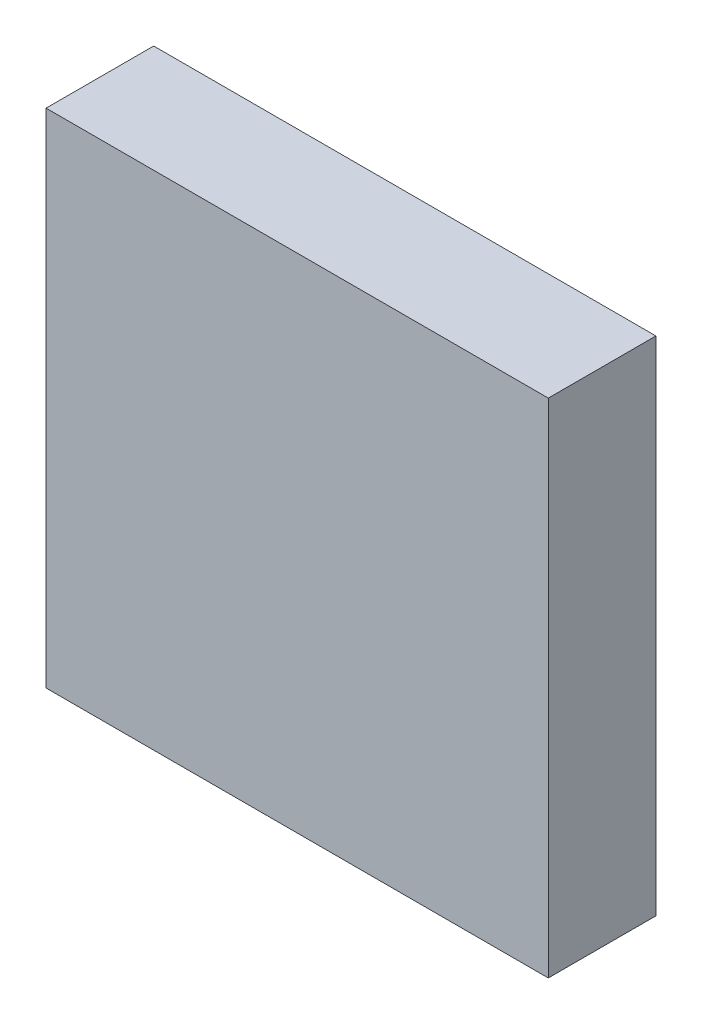
ISO-10303-21;
HEADER;
FILE_DESCRIPTION(('STEP AP214'),'2;1');
FILE_NAME('part.step','',(''),(''),'','','');
FILE_SCHEMA(('AUTOMOTIVE_DESIGN { 1 0 10303 214 1 1 1 1 }'));
ENDSEC;
DATA;
#1=APPLICATION_CONTEXT('core data for automotive mechanical design processes');
#2=APPLICATION_PROTOCOL_DEFINITION('international standard','automotive_design',2000,#1);
#3=PRODUCT_CONTEXT('',#1,'mechanical');
#4=PRODUCT('Part','Part','',(#3));
#5=PRODUCT_RELATED_PRODUCT_CATEGORY('part','',(#4));
#6=PRODUCT_DEFINITION_FORMATION('','',#4);
#7=PRODUCT_DEFINITION_CONTEXT('part definition',#1,'design');
#8=PRODUCT_DEFINITION('design','',#6,#7);
#9=PRODUCT_DEFINITION_SHAPE('','',#8);
#10=(LENGTH_UNIT() NAMED_UNIT(*) SI_UNIT(.MILLI.,.METRE.));
#11=(NAMED_UNIT(*) PLANE_ANGLE_UNIT() SI_UNIT($,.RADIAN.));
#12=(NAMED_UNIT(*) SI_UNIT($,.STERADIAN.) SOLID_ANGLE_UNIT());
#13=UNCERTAINTY_MEASURE_WITH_UNIT(LENGTH_MEASURE(1.E-05),#10,'distance_accuracy_value','');
#14=(GEOMETRIC_REPRESENTATION_CONTEXT(3) GLOBAL_UNCERTAINTY_ASSIGNED_CONTEXT((#13)) GLOBAL_UNIT_ASSIGNED_CONTEXT((#10,
#11,#12)) REPRESENTATION_CONTEXT('',''));
#15=CARTESIAN_POINT('',(0.,0.,0.));
#16=DIRECTION('',(0.,0.,1.));
#17=DIRECTION('',(1.,0.,0.));
#18=AXIS2_PLACEMENT_3D('',#15,#16,#17);
#19=CARTESIAN_POINT('',(0.,0.,19.05));
#20=DIRECTION('',(1.,0.,0.));
#21=DIRECTION('',(0.,0.,-1.));
#22=AXIS2_PLACEMENT_3D('',#19,#20,#21);
#23=PLANE('',#22);
#24=DIRECTION('',(0.,-1.,0.));
#25=VECTOR('',#24,1.);
#26=CARTESIAN_POINT('',(0.,0.,0.));
#27=LINE('',#26,#25);
#28=CARTESIAN_POINT('',(0.,88.9,0.));
#29=VERTEX_POINT('',#28);
#30=CARTESIAN_POINT('',(0.,0.,0.));
#31=VERTEX_POINT('',#30);
#32=EDGE_CURVE('E105',#29,#31,#27,.T.);
#33=ORIENTED_EDGE('',*,*,#32,.T.);
#34=DIRECTION('',(0.,0.,-1.));
#35=VECTOR('',#34,1.);
#36=CARTESIAN_POINT('',(0.,0.,19.05));
#37=LINE('',#36,#35);
#38=CARTESIAN_POINT('',(0.,0.,19.05));
#39=VERTEX_POINT('',#38);
#40=EDGE_CURVE('E11',#39,#31,#37,.T.);
#41=ORIENTED_EDGE('',*,*,#40,.F.);
#42=DIRECTION('',(0.,-1.,0.));
#43=VECTOR('',#42,1.);
#44=CARTESIAN_POINT('',(0.,0.,19.05));
#45=LINE('',#44,#43);
#46=CARTESIAN_POINT('',(0.,88.9,19.05));
#47=VERTEX_POINT('',#46);
#48=EDGE_CURVE('E89',#47,#39,#45,.T.);
#49=ORIENTED_EDGE('',*,*,#48,.F.);
#50=DIRECTION('',(0.,0.,-1.));
#51=VECTOR('',#50,1.);
#52=CARTESIAN_POINT('',(0.,88.9,19.05));
#53=LINE('',#52,#51);
#54=EDGE_CURVE('E97',#47,#29,#53,.T.);
#55=ORIENTED_EDGE('',*,*,#54,.T.);
#56=EDGE_LOOP('',(#33,#41,#49,#55));
#57=FACE_BOUND('',#56,.T.);
#58=ADVANCED_FACE('F39',(#57),#23,.F.);
#59=CARTESIAN_POINT('',(0.,0.,19.05));
#60=DIRECTION('',(0.,1.,0.));
#61=DIRECTION('',(0.,0.,1.));
#62=AXIS2_PLACEMENT_3D('',#59,#60,#61);
#63=PLANE('',#62);
#64=DIRECTION('',(1.,0.,0.));
#65=VECTOR('',#64,1.);
#66=CARTESIAN_POINT('',(0.,0.,0.));
#67=LINE('',#66,#65);
#68=CARTESIAN_POINT('',(88.9,0.,0.));
#69=VERTEX_POINT('',#68);
#70=EDGE_CURVE('E92',#31,#69,#67,.T.);
#71=ORIENTED_EDGE('',*,*,#70,.T.);
#72=DIRECTION('',(0.,0.,-1.));
#73=VECTOR('',#72,1.);
#74=CARTESIAN_POINT('',(88.9,0.,19.05));
#75=LINE('',#74,#73);
#76=CARTESIAN_POINT('',(88.9,0.,19.05));
#77=VERTEX_POINT('',#76);
#78=EDGE_CURVE('E50',#77,#69,#75,.T.);
#79=ORIENTED_EDGE('',*,*,#78,.F.);
#80=DIRECTION('',(1.,0.,0.));
#81=VECTOR('',#80,1.);
#82=CARTESIAN_POINT('',(0.,0.,19.05));
#83=LINE('',#82,#81);
#84=EDGE_CURVE('E82',#39,#77,#83,.T.);
#85=ORIENTED_EDGE('',*,*,#84,.F.);
#86=ORIENTED_EDGE('',*,*,#40,.T.);
#87=EDGE_LOOP('',(#71,#79,#85,#86));
#88=FACE_BOUND('',#87,.T.);
#89=ADVANCED_FACE('F93',(#88),#63,.F.);
#90=CARTESIAN_POINT('',(88.9,0.,19.05));
#91=DIRECTION('',(-1.,0.,0.));
#92=DIRECTION('',(0.,0.,1.));
#93=AXIS2_PLACEMENT_3D('',#90,#91,#92);
#94=PLANE('',#93);
#95=DIRECTION('',(0.,1.,0.));
#96=VECTOR('',#95,1.);
#97=CARTESIAN_POINT('',(88.9,0.,0.));
#98=LINE('',#97,#96);
#99=CARTESIAN_POINT('',(88.9,88.9,0.));
#100=VERTEX_POINT('',#99);
#101=EDGE_CURVE('E72',#69,#100,#98,.T.);
#102=ORIENTED_EDGE('',*,*,#101,.T.);
#103=DIRECTION('',(0.,0.,-1.));
#104=VECTOR('',#103,1.);
#105=CARTESIAN_POINT('',(88.9,88.9,19.05));
#106=LINE('',#105,#104);
#107=CARTESIAN_POINT('',(88.9,88.9,19.05));
#108=VERTEX_POINT('',#107);
#109=EDGE_CURVE('E94',#108,#100,#106,.T.);
#110=ORIENTED_EDGE('',*,*,#109,.F.);
#111=DIRECTION('',(0.,1.,0.));
#112=VECTOR('',#111,1.);
#113=CARTESIAN_POINT('',(88.9,0.,19.05));
#114=LINE('',#113,#112);
#115=EDGE_CURVE('E88',#77,#108,#114,.T.);
#116=ORIENTED_EDGE('',*,*,#115,.F.);
#117=ORIENTED_EDGE('',*,*,#78,.T.);
#118=EDGE_LOOP('',(#102,#110,#116,#117));
#119=FACE_BOUND('',#118,.T.);
#120=ADVANCED_FACE('F96',(#119),#94,.F.);
#121=CARTESIAN_POINT('',(0.,88.9,19.05));
#122=DIRECTION('',(0.,-1.,0.));
#123=DIRECTION('',(0.,0.,-1.));
#124=AXIS2_PLACEMENT_3D('',#121,#122,#123);
#125=PLANE('',#124);
#126=DIRECTION('',(-1.,0.,0.));
#127=VECTOR('',#126,1.);
#128=CARTESIAN_POINT('',(0.,88.9,0.));
#129=LINE('',#128,#127);
#130=EDGE_CURVE('E76',#100,#29,#129,.T.);
#131=ORIENTED_EDGE('',*,*,#130,.T.);
#132=ORIENTED_EDGE('',*,*,#54,.F.);
#133=DIRECTION('',(-1.,0.,0.));
#134=VECTOR('',#133,1.);
#135=CARTESIAN_POINT('',(0.,88.9,19.05));
#136=LINE('',#135,#134);
#137=EDGE_CURVE('E54',#108,#47,#136,.T.);
#138=ORIENTED_EDGE('',*,*,#137,.F.);
#139=ORIENTED_EDGE('',*,*,#109,.T.);
#140=EDGE_LOOP('',(#131,#132,#138,#139));
#141=FACE_BOUND('',#140,.T.);
#142=ADVANCED_FACE('F108',(#141),#125,.F.);
#143=CARTESIAN_POINT('',(0.,0.,19.05));
#144=DIRECTION('',(0.,0.,-1.));
#145=DIRECTION('',(-1.,0.,0.));
#146=AXIS2_PLACEMENT_3D('',#143,#144,#145);
#147=PLANE('',#146);
#148=ORIENTED_EDGE('',*,*,#48,.T.);
#149=ORIENTED_EDGE('',*,*,#84,.T.);
#150=ORIENTED_EDGE('',*,*,#115,.T.);
#151=ORIENTED_EDGE('',*,*,#137,.T.);
#152=EDGE_LOOP('',(#148,#149,#150,#151));
#153=FACE_BOUND('',#152,.T.);
#154=ADVANCED_FACE('F86',(#153),#147,.F.);
#155=CARTESIAN_POINT('',(0.,0.,0.));
#156=DIRECTION('',(0.,0.,-1.));
#157=DIRECTION('',(-1.,0.,0.));
#158=AXIS2_PLACEMENT_3D('',#155,#156,#157);
#159=PLANE('',#158);
#160=ORIENTED_EDGE('',*,*,#32,.F.);
#161=ORIENTED_EDGE('',*,*,#130,.F.);
#162=ORIENTED_EDGE('',*,*,#101,.F.);
#163=ORIENTED_EDGE('',*,*,#70,.F.);
#164=EDGE_LOOP('',(#160,#161,#162,#163));
#165=FACE_BOUND('',#164,.T.);
#166=ADVANCED_FACE('F115',(#165),#159,.T.);
#167=CLOSED_SHELL('',(#58,#89,#120,#142,#154,#166));
#168=MANIFOLD_SOLID_BREP('B2',#167);
#169=ADVANCED_BREP_SHAPE_REPRESENTATION('',(#18,#168),#14);
#170=SHAPE_DEFINITION_REPRESENTATION(#9,#169);
ENDSEC;
END-ISO-10303-21;
